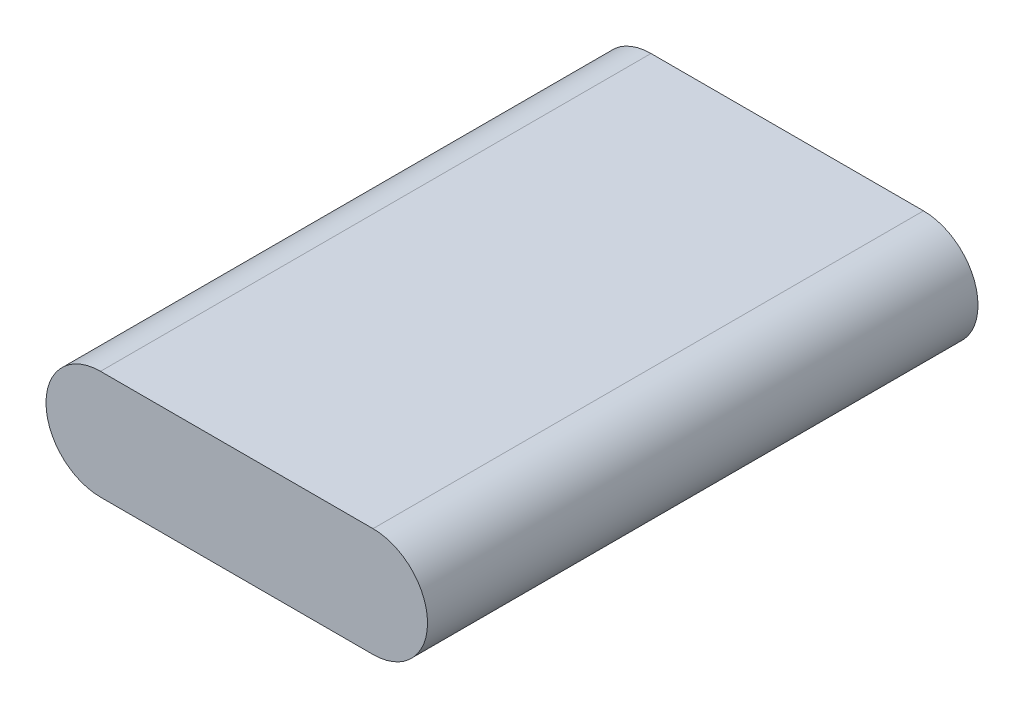
ISO-10303-21;
HEADER;
FILE_DESCRIPTION(('STEP AP214'),'2;1');
FILE_NAME('part.step','',(''),(''),'','','');
FILE_SCHEMA(('AUTOMOTIVE_DESIGN { 1 0 10303 214 1 1 1 1 }'));
ENDSEC;
DATA;
#1=APPLICATION_CONTEXT('core data for automotive mechanical design processes');
#2=APPLICATION_PROTOCOL_DEFINITION('international standard','automotive_design',2000,#1);
#3=PRODUCT_CONTEXT('',#1,'mechanical');
#4=PRODUCT('Part','Part','',(#3));
#5=PRODUCT_RELATED_PRODUCT_CATEGORY('part','',(#4));
#6=PRODUCT_DEFINITION_FORMATION('','',#4);
#7=PRODUCT_DEFINITION_CONTEXT('part definition',#1,'design');
#8=PRODUCT_DEFINITION('design','',#6,#7);
#9=PRODUCT_DEFINITION_SHAPE('','',#8);
#10=(LENGTH_UNIT() NAMED_UNIT(*) SI_UNIT(.MILLI.,.METRE.));
#11=(NAMED_UNIT(*) PLANE_ANGLE_UNIT() SI_UNIT($,.RADIAN.));
#12=(NAMED_UNIT(*) SI_UNIT($,.STERADIAN.) SOLID_ANGLE_UNIT());
#13=UNCERTAINTY_MEASURE_WITH_UNIT(LENGTH_MEASURE(1.E-05),#10,'distance_accuracy_value','');
#14=(GEOMETRIC_REPRESENTATION_CONTEXT(3) GLOBAL_UNCERTAINTY_ASSIGNED_CONTEXT((#13)) GLOBAL_UNIT_ASSIGNED_CONTEXT((#10,
#11,#12)) REPRESENTATION_CONTEXT('',''));
#15=CARTESIAN_POINT('',(0.,0.,0.));
#16=DIRECTION('',(0.,0.,1.));
#17=DIRECTION('',(1.,0.,0.));
#18=AXIS2_PLACEMENT_3D('',#15,#16,#17);
#19=CARTESIAN_POINT('',(-32.8050384234394,0.,101.));
#20=DIRECTION('',(0.,0.,-1.));
#21=DIRECTION('',(-1.,0.,0.));
#22=AXIS2_PLACEMENT_3D('',#19,#20,#21);
#23=CYLINDRICAL_SURFACE('',#22,10.);
#24=CARTESIAN_POINT('',(-32.8050384234394,0.,0.));
#25=DIRECTION('',(0.,0.,1.));
#26=DIRECTION('',(1.,0.,0.));
#27=AXIS2_PLACEMENT_3D('',#24,#25,#26);
#28=CIRCLE('',#27,10.);
#29=CARTESIAN_POINT('',(-32.8050384234394,10.,0.));
#30=VERTEX_POINT('',#29);
#31=CARTESIAN_POINT('',(-32.8050384234394,-10.,0.));
#32=VERTEX_POINT('',#31);
#33=EDGE_CURVE('E97',#30,#32,#28,.T.);
#34=ORIENTED_EDGE('',*,*,#33,.T.);
#35=DIRECTION('',(0.,0.,-1.));
#36=VECTOR('',#35,1.);
#37=CARTESIAN_POINT('',(-32.8050384234394,-10.,101.));
#38=LINE('',#37,#36);
#39=CARTESIAN_POINT('',(-32.8050384234394,-10.,101.));
#40=VERTEX_POINT('',#39);
#41=EDGE_CURVE('E11',#40,#32,#38,.T.);
#42=ORIENTED_EDGE('',*,*,#41,.F.);
#43=CARTESIAN_POINT('',(-32.8050384234394,0.,101.));
#44=DIRECTION('',(0.,0.,1.));
#45=DIRECTION('',(1.,0.,0.));
#46=AXIS2_PLACEMENT_3D('',#43,#44,#45);
#47=CIRCLE('',#46,10.);
#48=CARTESIAN_POINT('',(-32.8050384234394,10.,101.));
#49=VERTEX_POINT('',#48);
#50=EDGE_CURVE('E85',#49,#40,#47,.T.);
#51=ORIENTED_EDGE('',*,*,#50,.F.);
#52=DIRECTION('',(0.,0.,-1.));
#53=VECTOR('',#52,1.);
#54=CARTESIAN_POINT('',(-32.8050384234394,10.,101.));
#55=LINE('',#54,#53);
#56=EDGE_CURVE('E93',#49,#30,#55,.T.);
#57=ORIENTED_EDGE('',*,*,#56,.T.);
#58=EDGE_LOOP('',(#34,#42,#51,#57));
#59=FACE_BOUND('',#58,.T.);
#60=ADVANCED_FACE('F34',(#59),#23,.T.);
#61=CARTESIAN_POINT('',(-32.8050384234394,-10.,101.));
#62=DIRECTION('',(0.,1.,0.));
#63=DIRECTION('',(0.,0.,1.));
#64=AXIS2_PLACEMENT_3D('',#61,#62,#63);
#65=PLANE('',#64);
#66=DIRECTION('',(1.,0.,0.));
#67=VECTOR('',#66,1.);
#68=CARTESIAN_POINT('',(-32.8050384234394,-10.,0.));
#69=LINE('',#68,#67);
#70=CARTESIAN_POINT('',(17.1949615765605,-10.,0.));
#71=VERTEX_POINT('',#70);
#72=EDGE_CURVE('E89',#32,#71,#69,.T.);
#73=ORIENTED_EDGE('',*,*,#72,.T.);
#74=DIRECTION('',(0.,0.,-1.));
#75=VECTOR('',#74,1.);
#76=CARTESIAN_POINT('',(17.1949615765605,-10.,101.));
#77=LINE('',#76,#75);
#78=CARTESIAN_POINT('',(17.1949615765605,-10.,101.));
#79=VERTEX_POINT('',#78);
#80=EDGE_CURVE('E42',#79,#71,#77,.T.);
#81=ORIENTED_EDGE('',*,*,#80,.F.);
#82=DIRECTION('',(1.,0.,0.));
#83=VECTOR('',#82,1.);
#84=CARTESIAN_POINT('',(-32.8050384234394,-10.,101.));
#85=LINE('',#84,#83);
#86=EDGE_CURVE('E80',#40,#79,#85,.T.);
#87=ORIENTED_EDGE('',*,*,#86,.F.);
#88=ORIENTED_EDGE('',*,*,#41,.T.);
#89=EDGE_LOOP('',(#73,#81,#87,#88));
#90=FACE_BOUND('',#89,.T.);
#91=ADVANCED_FACE('F88',(#90),#65,.F.);
#92=CARTESIAN_POINT('',(17.1949615765606,0.,101.));
#93=DIRECTION('',(0.,0.,-1.));
#94=DIRECTION('',(-1.,0.,0.));
#95=AXIS2_PLACEMENT_3D('',#92,#93,#94);
#96=CYLINDRICAL_SURFACE('',#95,10.);
#97=CARTESIAN_POINT('',(17.1949615765606,0.,0.));
#98=DIRECTION('',(0.,0.,1.));
#99=DIRECTION('',(1.,0.,0.));
#100=AXIS2_PLACEMENT_3D('',#97,#98,#99);
#101=CIRCLE('',#100,10.);
#102=CARTESIAN_POINT('',(17.1949615765606,10.,0.));
#103=VERTEX_POINT('',#102);
#104=EDGE_CURVE('E67',#71,#103,#101,.T.);
#105=ORIENTED_EDGE('',*,*,#104,.T.);
#106=DIRECTION('',(0.,0.,-1.));
#107=VECTOR('',#106,1.);
#108=CARTESIAN_POINT('',(17.1949615765606,10.,101.));
#109=LINE('',#108,#107);
#110=CARTESIAN_POINT('',(17.1949615765606,10.,101.));
#111=VERTEX_POINT('',#110);
#112=EDGE_CURVE('E90',#111,#103,#109,.T.);
#113=ORIENTED_EDGE('',*,*,#112,.F.);
#114=CARTESIAN_POINT('',(17.1949615765606,0.,101.));
#115=DIRECTION('',(0.,0.,1.));
#116=DIRECTION('',(1.,0.,0.));
#117=AXIS2_PLACEMENT_3D('',#114,#115,#116);
#118=CIRCLE('',#117,10.);
#119=EDGE_CURVE('E83',#79,#111,#118,.T.);
#120=ORIENTED_EDGE('',*,*,#119,.F.);
#121=ORIENTED_EDGE('',*,*,#80,.T.);
#122=EDGE_LOOP('',(#105,#113,#120,#121));
#123=FACE_BOUND('',#122,.T.);
#124=ADVANCED_FACE('F91',(#123),#96,.T.);
#125=CARTESIAN_POINT('',(-32.8050384234394,10.,101.));
#126=DIRECTION('',(0.,-1.,0.));
#127=DIRECTION('',(1.,0.,0.));
#128=AXIS2_PLACEMENT_3D('',#125,#126,#127);
#129=PLANE('',#128);
#130=DIRECTION('',(-1.,0.,0.));
#131=VECTOR('',#130,1.);
#132=CARTESIAN_POINT('',(-32.8050384234394,10.,0.));
#133=LINE('',#132,#131);
#134=EDGE_CURVE('E73',#103,#30,#133,.T.);
#135=ORIENTED_EDGE('',*,*,#134,.T.);
#136=ORIENTED_EDGE('',*,*,#56,.F.);
#137=DIRECTION('',(-1.,0.,0.));
#138=VECTOR('',#137,1.);
#139=CARTESIAN_POINT('',(-32.8050384234394,10.,101.));
#140=LINE('',#139,#138);
#141=EDGE_CURVE('E50',#111,#49,#140,.T.);
#142=ORIENTED_EDGE('',*,*,#141,.F.);
#143=ORIENTED_EDGE('',*,*,#112,.T.);
#144=EDGE_LOOP('',(#135,#136,#142,#143));
#145=FACE_BOUND('',#144,.T.);
#146=ADVANCED_FACE('F104',(#145),#129,.F.);
#147=CARTESIAN_POINT('',(-32.8050384234394,0.,101.));
#148=DIRECTION('',(0.,0.,1.));
#149=DIRECTION('',(1.,0.,0.));
#150=AXIS2_PLACEMENT_3D('',#147,#148,#149);
#151=PLANE('',#150);
#152=ORIENTED_EDGE('',*,*,#50,.T.);
#153=ORIENTED_EDGE('',*,*,#86,.T.);
#154=ORIENTED_EDGE('',*,*,#119,.T.);
#155=ORIENTED_EDGE('',*,*,#141,.T.);
#156=EDGE_LOOP('',(#152,#153,#154,#155));
#157=FACE_BOUND('',#156,.T.);
#158=ADVANCED_FACE('F81',(#157),#151,.T.);
#159=CARTESIAN_POINT('',(-32.8050384234394,0.,0.));
#160=DIRECTION('',(0.,0.,1.));
#161=DIRECTION('',(1.,0.,0.));
#162=AXIS2_PLACEMENT_3D('',#159,#160,#161);
#163=PLANE('',#162);
#164=ORIENTED_EDGE('',*,*,#33,.F.);
#165=ORIENTED_EDGE('',*,*,#134,.F.);
#166=ORIENTED_EDGE('',*,*,#104,.F.);
#167=ORIENTED_EDGE('',*,*,#72,.F.);
#168=EDGE_LOOP('',(#164,#165,#166,#167));
#169=FACE_BOUND('',#168,.T.);
#170=ADVANCED_FACE('F107',(#169),#163,.F.);
#171=CLOSED_SHELL('',(#60,#91,#124,#146,#158,#170));
#172=MANIFOLD_SOLID_BREP('B2',#171);
#173=ADVANCED_BREP_SHAPE_REPRESENTATION('',(#18,#172),#14);
#174=SHAPE_DEFINITION_REPRESENTATION(#9,#173);
ENDSEC;
END-ISO-10303-21;
